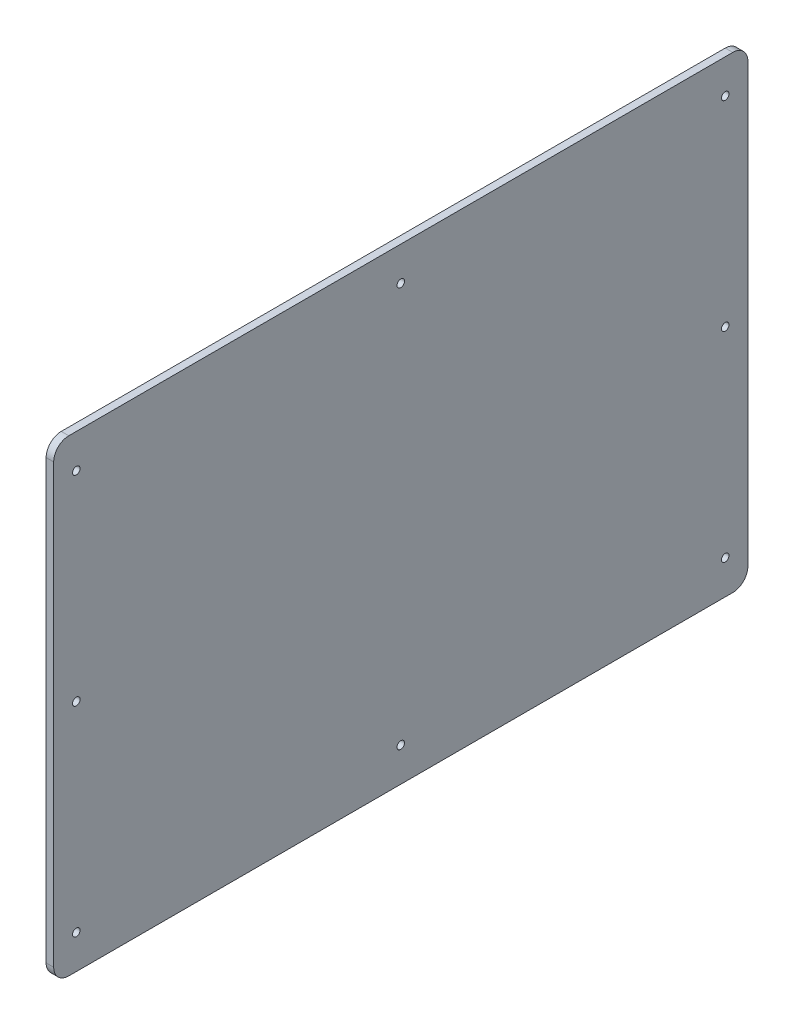
ISO-10303-21;
HEADER;
FILE_DESCRIPTION(('STEP AP214'),'2;1');
FILE_NAME('part.step','',(''),(''),'','','');
FILE_SCHEMA(('AUTOMOTIVE_DESIGN { 1 0 10303 214 1 1 1 1 }'));
ENDSEC;
DATA;
#1=APPLICATION_CONTEXT('core data for automotive mechanical design processes');
#2=APPLICATION_PROTOCOL_DEFINITION('international standard','automotive_design',2000,#1);
#3=PRODUCT_CONTEXT('',#1,'mechanical');
#4=PRODUCT('Part','Part','',(#3));
#5=PRODUCT_RELATED_PRODUCT_CATEGORY('part','',(#4));
#6=PRODUCT_DEFINITION_FORMATION('','',#4);
#7=PRODUCT_DEFINITION_CONTEXT('part definition',#1,'design');
#8=PRODUCT_DEFINITION('design','',#6,#7);
#9=PRODUCT_DEFINITION_SHAPE('','',#8);
#10=(LENGTH_UNIT() NAMED_UNIT(*) SI_UNIT(.MILLI.,.METRE.));
#11=(NAMED_UNIT(*) PLANE_ANGLE_UNIT() SI_UNIT($,.RADIAN.));
#12=(NAMED_UNIT(*) SI_UNIT($,.STERADIAN.) SOLID_ANGLE_UNIT());
#13=UNCERTAINTY_MEASURE_WITH_UNIT(LENGTH_MEASURE(1.E-05),#10,'distance_accuracy_value','');
#14=(GEOMETRIC_REPRESENTATION_CONTEXT(3) GLOBAL_UNCERTAINTY_ASSIGNED_CONTEXT((#13)) GLOBAL_UNIT_ASSIGNED_CONTEXT((#10,
#11,#12)) REPRESENTATION_CONTEXT('',''));
#15=CARTESIAN_POINT('',(0.,0.,0.));
#16=DIRECTION('',(0.,0.,1.));
#17=DIRECTION('',(1.,0.,0.));
#18=AXIS2_PLACEMENT_3D('',#15,#16,#17);
#19=CARTESIAN_POINT('',(493.5,145.,130.));
#20=DIRECTION('',(1.,0.,0.));
#21=DIRECTION('',(0.,0.,1.));
#22=AXIS2_PLACEMENT_3D('',#19,#20,#21);
#23=CYLINDRICAL_SURFACE('',#22,10.);
#24=CARTESIAN_POINT('',(498.5,145.,130.));
#25=DIRECTION('',(-1.,0.,0.));
#26=DIRECTION('',(0.,0.,1.));
#27=AXIS2_PLACEMENT_3D('',#24,#25,#26);
#28=CIRCLE('',#27,10.);
#29=CARTESIAN_POINT('',(498.5,155.,130.));
#30=VERTEX_POINT('',#29);
#31=CARTESIAN_POINT('',(498.5,145.,120.));
#32=VERTEX_POINT('',#31);
#33=EDGE_CURVE('E153',#30,#32,#28,.T.);
#34=ORIENTED_EDGE('',*,*,#33,.T.);
#35=DIRECTION('',(1.,0.,0.));
#36=VECTOR('',#35,1.);
#37=CARTESIAN_POINT('',(493.5,145.,120.));
#38=LINE('',#37,#36);
#39=CARTESIAN_POINT('',(493.5,145.,120.));
#40=VERTEX_POINT('',#39);
#41=EDGE_CURVE('E45',#40,#32,#38,.T.);
#42=ORIENTED_EDGE('',*,*,#41,.F.);
#43=CARTESIAN_POINT('',(493.5,145.,130.));
#44=DIRECTION('',(-1.,0.,0.));
#45=DIRECTION('',(0.,0.,1.));
#46=AXIS2_PLACEMENT_3D('',#43,#44,#45);
#47=CIRCLE('',#46,10.);
#48=CARTESIAN_POINT('',(493.5,155.,130.));
#49=VERTEX_POINT('',#48);
#50=EDGE_CURVE('E167',#49,#40,#47,.T.);
#51=ORIENTED_EDGE('',*,*,#50,.F.);
#52=DIRECTION('',(1.,0.,0.));
#53=VECTOR('',#52,1.);
#54=CARTESIAN_POINT('',(493.5,155.,130.));
#55=LINE('',#54,#53);
#56=EDGE_CURVE('E11',#49,#30,#55,.T.);
#57=ORIENTED_EDGE('',*,*,#56,.T.);
#58=EDGE_LOOP('',(#34,#42,#51,#57));
#59=FACE_BOUND('',#58,.T.);
#60=ADVANCED_FACE('F42',(#59),#23,.T.);
#61=CARTESIAN_POINT('',(493.5,155.,570.));
#62=DIRECTION('',(0.,1.,0.));
#63=DIRECTION('',(0.,0.,1.));
#64=AXIS2_PLACEMENT_3D('',#61,#62,#63);
#65=PLANE('',#64);
#66=DIRECTION('',(0.,0.,-1.));
#67=VECTOR('',#66,1.);
#68=CARTESIAN_POINT('',(498.5,155.,570.));
#69=LINE('',#68,#67);
#70=CARTESIAN_POINT('',(498.5,155.,570.));
#71=VERTEX_POINT('',#70);
#72=EDGE_CURVE('E103',#71,#30,#69,.T.);
#73=ORIENTED_EDGE('',*,*,#72,.T.);
#74=ORIENTED_EDGE('',*,*,#56,.F.);
#75=DIRECTION('',(0.,0.,-1.));
#76=VECTOR('',#75,1.);
#77=CARTESIAN_POINT('',(493.5,155.,570.));
#78=LINE('',#77,#76);
#79=CARTESIAN_POINT('',(493.5,155.,570.));
#80=VERTEX_POINT('',#79);
#81=EDGE_CURVE('E64',#80,#49,#78,.T.);
#82=ORIENTED_EDGE('',*,*,#81,.F.);
#83=DIRECTION('',(1.,0.,0.));
#84=VECTOR('',#83,1.);
#85=CARTESIAN_POINT('',(493.5,155.,570.));
#86=LINE('',#85,#84);
#87=EDGE_CURVE('E51',#80,#71,#86,.T.);
#88=ORIENTED_EDGE('',*,*,#87,.T.);
#89=EDGE_LOOP('',(#73,#74,#82,#88));
#90=FACE_BOUND('',#89,.T.);
#91=ADVANCED_FACE('F286',(#90),#65,.T.);
#92=CARTESIAN_POINT('',(493.5,145.,570.));
#93=DIRECTION('',(1.,0.,0.));
#94=DIRECTION('',(0.,0.,1.));
#95=AXIS2_PLACEMENT_3D('',#92,#93,#94);
#96=CYLINDRICAL_SURFACE('',#95,10.);
#97=CARTESIAN_POINT('',(498.5,145.,570.));
#98=DIRECTION('',(-1.,0.,0.));
#99=DIRECTION('',(0.,0.,1.));
#100=AXIS2_PLACEMENT_3D('',#97,#98,#99);
#101=CIRCLE('',#100,10.);
#102=CARTESIAN_POINT('',(498.5,145.,580.));
#103=VERTEX_POINT('',#102);
#104=EDGE_CURVE('E96',#103,#71,#101,.T.);
#105=ORIENTED_EDGE('',*,*,#104,.T.);
#106=ORIENTED_EDGE('',*,*,#87,.F.);
#107=CARTESIAN_POINT('',(493.5,145.,570.));
#108=DIRECTION('',(-1.,0.,0.));
#109=DIRECTION('',(0.,0.,1.));
#110=AXIS2_PLACEMENT_3D('',#107,#108,#109);
#111=CIRCLE('',#110,10.);
#112=CARTESIAN_POINT('',(493.5,145.,580.));
#113=VERTEX_POINT('',#112);
#114=EDGE_CURVE('E135',#113,#80,#111,.T.);
#115=ORIENTED_EDGE('',*,*,#114,.F.);
#116=DIRECTION('',(1.,0.,0.));
#117=VECTOR('',#116,1.);
#118=CARTESIAN_POINT('',(493.5,145.,580.));
#119=LINE('',#118,#117);
#120=EDGE_CURVE('E142',#113,#103,#119,.T.);
#121=ORIENTED_EDGE('',*,*,#120,.T.);
#122=EDGE_LOOP('',(#105,#106,#115,#121));
#123=FACE_BOUND('',#122,.T.);
#124=ADVANCED_FACE('F148',(#123),#96,.T.);
#125=CARTESIAN_POINT('',(493.5,-145.,580.));
#126=DIRECTION('',(0.,0.,1.));
#127=DIRECTION('',(-1.,0.,0.));
#128=AXIS2_PLACEMENT_3D('',#125,#126,#127);
#129=PLANE('',#128);
#130=DIRECTION('',(0.,1.,0.));
#131=VECTOR('',#130,1.);
#132=CARTESIAN_POINT('',(498.5,-145.,580.));
#133=LINE('',#132,#131);
#134=CARTESIAN_POINT('',(498.5,-145.,580.));
#135=VERTEX_POINT('',#134);
#136=EDGE_CURVE('E145',#135,#103,#133,.T.);
#137=ORIENTED_EDGE('',*,*,#136,.T.);
#138=ORIENTED_EDGE('',*,*,#120,.F.);
#139=DIRECTION('',(0.,1.,0.));
#140=VECTOR('',#139,1.);
#141=CARTESIAN_POINT('',(493.5,-145.,580.));
#142=LINE('',#141,#140);
#143=CARTESIAN_POINT('',(493.5,-145.,580.));
#144=VERTEX_POINT('',#143);
#145=EDGE_CURVE('E131',#144,#113,#142,.T.);
#146=ORIENTED_EDGE('',*,*,#145,.F.);
#147=DIRECTION('',(1.,0.,0.));
#148=VECTOR('',#147,1.);
#149=CARTESIAN_POINT('',(493.5,-145.,580.));
#150=LINE('',#149,#148);
#151=EDGE_CURVE('E146',#144,#135,#150,.T.);
#152=ORIENTED_EDGE('',*,*,#151,.T.);
#153=EDGE_LOOP('',(#137,#138,#146,#152));
#154=FACE_BOUND('',#153,.T.);
#155=ADVANCED_FACE('F143',(#154),#129,.T.);
#156=CARTESIAN_POINT('',(493.5,-145.,570.));
#157=DIRECTION('',(1.,0.,0.));
#158=DIRECTION('',(0.,0.,1.));
#159=AXIS2_PLACEMENT_3D('',#156,#157,#158);
#160=CYLINDRICAL_SURFACE('',#159,10.);
#161=CARTESIAN_POINT('',(498.5,-145.,570.));
#162=DIRECTION('',(-1.,0.,0.));
#163=DIRECTION('',(0.,0.,1.));
#164=AXIS2_PLACEMENT_3D('',#161,#162,#163);
#165=CIRCLE('',#164,10.);
#166=CARTESIAN_POINT('',(498.5,-155.,570.));
#167=VERTEX_POINT('',#166);
#168=EDGE_CURVE('E163',#167,#135,#165,.T.);
#169=ORIENTED_EDGE('',*,*,#168,.T.);
#170=ORIENTED_EDGE('',*,*,#151,.F.);
#171=CARTESIAN_POINT('',(493.5,-145.,570.));
#172=DIRECTION('',(-1.,0.,0.));
#173=DIRECTION('',(0.,0.,1.));
#174=AXIS2_PLACEMENT_3D('',#171,#172,#173);
#175=CIRCLE('',#174,10.);
#176=CARTESIAN_POINT('',(493.5,-155.,570.));
#177=VERTEX_POINT('',#176);
#178=EDGE_CURVE('E137',#177,#144,#175,.T.);
#179=ORIENTED_EDGE('',*,*,#178,.F.);
#180=DIRECTION('',(1.,0.,0.));
#181=VECTOR('',#180,1.);
#182=CARTESIAN_POINT('',(493.5,-155.,570.));
#183=LINE('',#182,#181);
#184=EDGE_CURVE('E171',#177,#167,#183,.T.);
#185=ORIENTED_EDGE('',*,*,#184,.T.);
#186=EDGE_LOOP('',(#169,#170,#179,#185));
#187=FACE_BOUND('',#186,.T.);
#188=ADVANCED_FACE('F297',(#187),#160,.T.);
#189=CARTESIAN_POINT('',(493.5,-155.,130.));
#190=DIRECTION('',(0.,-1.,0.));
#191=DIRECTION('',(0.,0.,-1.));
#192=AXIS2_PLACEMENT_3D('',#189,#190,#191);
#193=PLANE('',#192);
#194=DIRECTION('',(0.,0.,1.));
#195=VECTOR('',#194,1.);
#196=CARTESIAN_POINT('',(498.5,-155.,130.));
#197=LINE('',#196,#195);
#198=CARTESIAN_POINT('',(498.5,-155.,130.));
#199=VERTEX_POINT('',#198);
#200=EDGE_CURVE('E161',#199,#167,#197,.T.);
#201=ORIENTED_EDGE('',*,*,#200,.T.);
#202=ORIENTED_EDGE('',*,*,#184,.F.);
#203=DIRECTION('',(0.,0.,1.));
#204=VECTOR('',#203,1.);
#205=CARTESIAN_POINT('',(493.5,-155.,130.));
#206=LINE('',#205,#204);
#207=CARTESIAN_POINT('',(493.5,-155.,130.));
#208=VERTEX_POINT('',#207);
#209=EDGE_CURVE('E196',#208,#177,#206,.T.);
#210=ORIENTED_EDGE('',*,*,#209,.F.);
#211=DIRECTION('',(1.,0.,0.));
#212=VECTOR('',#211,1.);
#213=CARTESIAN_POINT('',(493.5,-155.,130.));
#214=LINE('',#213,#212);
#215=EDGE_CURVE('E174',#208,#199,#214,.T.);
#216=ORIENTED_EDGE('',*,*,#215,.T.);
#217=EDGE_LOOP('',(#201,#202,#210,#216));
#218=FACE_BOUND('',#217,.T.);
#219=ADVANCED_FACE('F194',(#218),#193,.T.);
#220=CARTESIAN_POINT('',(493.5,-145.,130.));
#221=DIRECTION('',(1.,0.,0.));
#222=DIRECTION('',(0.,0.,1.));
#223=AXIS2_PLACEMENT_3D('',#220,#221,#222);
#224=CYLINDRICAL_SURFACE('',#223,10.);
#225=CARTESIAN_POINT('',(498.5,-145.,130.));
#226=DIRECTION('',(-1.,0.,0.));
#227=DIRECTION('',(0.,0.,1.));
#228=AXIS2_PLACEMENT_3D('',#225,#226,#227);
#229=CIRCLE('',#228,10.);
#230=CARTESIAN_POINT('',(498.5,-145.,120.));
#231=VERTEX_POINT('',#230);
#232=EDGE_CURVE('E159',#231,#199,#229,.T.);
#233=ORIENTED_EDGE('',*,*,#232,.T.);
#234=ORIENTED_EDGE('',*,*,#215,.F.);
#235=CARTESIAN_POINT('',(493.5,-145.,130.));
#236=DIRECTION('',(-1.,0.,0.));
#237=DIRECTION('',(0.,0.,1.));
#238=AXIS2_PLACEMENT_3D('',#235,#236,#237);
#239=CIRCLE('',#238,10.);
#240=CARTESIAN_POINT('',(493.5,-145.,120.));
#241=VERTEX_POINT('',#240);
#242=EDGE_CURVE('E197',#241,#208,#239,.T.);
#243=ORIENTED_EDGE('',*,*,#242,.F.);
#244=DIRECTION('',(1.,0.,0.));
#245=VECTOR('',#244,1.);
#246=CARTESIAN_POINT('',(493.5,-145.,120.));
#247=LINE('',#246,#245);
#248=EDGE_CURVE('E176',#241,#231,#247,.T.);
#249=ORIENTED_EDGE('',*,*,#248,.T.);
#250=EDGE_LOOP('',(#233,#234,#243,#249));
#251=FACE_BOUND('',#250,.T.);
#252=ADVANCED_FACE('F191',(#251),#224,.T.);
#253=CARTESIAN_POINT('',(493.5,145.,120.));
#254=DIRECTION('',(0.,0.,-1.));
#255=DIRECTION('',(0.,1.,0.));
#256=AXIS2_PLACEMENT_3D('',#253,#254,#255);
#257=PLANE('',#256);
#258=DIRECTION('',(0.,-1.,0.));
#259=VECTOR('',#258,1.);
#260=CARTESIAN_POINT('',(498.5,145.,120.));
#261=LINE('',#260,#259);
#262=EDGE_CURVE('E156',#32,#231,#261,.T.);
#263=ORIENTED_EDGE('',*,*,#262,.T.);
#264=ORIENTED_EDGE('',*,*,#248,.F.);
#265=DIRECTION('',(0.,-1.,0.));
#266=VECTOR('',#265,1.);
#267=CARTESIAN_POINT('',(493.5,145.,120.));
#268=LINE('',#267,#266);
#269=EDGE_CURVE('E113',#40,#241,#268,.T.);
#270=ORIENTED_EDGE('',*,*,#269,.F.);
#271=ORIENTED_EDGE('',*,*,#41,.T.);
#272=EDGE_LOOP('',(#263,#264,#270,#271));
#273=FACE_BOUND('',#272,.T.);
#274=ADVANCED_FACE('F182',(#273),#257,.T.);
#275=CARTESIAN_POINT('',(493.5,145.,130.));
#276=DIRECTION('',(1.,0.,0.));
#277=DIRECTION('',(0.,0.,1.));
#278=AXIS2_PLACEMENT_3D('',#275,#276,#277);
#279=PLANE('',#278);
#280=CARTESIAN_POINT('',(493.5,132.5,135.));
#281=DIRECTION('',(-1.,0.,0.));
#282=DIRECTION('',(0.,0.,1.));
#283=AXIS2_PLACEMENT_3D('',#280,#281,#282);
#284=CIRCLE('',#283,2.5);
#285=CARTESIAN_POINT('',(493.5,132.5,137.5));
#286=VERTEX_POINT('',#285);
#287=EDGE_CURVE('E242',#286,#286,#284,.T.);
#288=ORIENTED_EDGE('',*,*,#287,.F.);
#289=EDGE_LOOP('',(#288));
#290=FACE_BOUND('',#289,.T.);
#291=CARTESIAN_POINT('',(493.5,132.5,565.));
#292=DIRECTION('',(-1.,0.,0.));
#293=DIRECTION('',(0.,0.,1.));
#294=AXIS2_PLACEMENT_3D('',#291,#292,#293);
#295=CIRCLE('',#294,2.49999999999991);
#296=CARTESIAN_POINT('',(493.5,132.5,567.5));
#297=VERTEX_POINT('',#296);
#298=EDGE_CURVE('E236',#297,#297,#295,.T.);
#299=ORIENTED_EDGE('',*,*,#298,.F.);
#300=EDGE_LOOP('',(#299));
#301=FACE_BOUND('',#300,.T.);
#302=CARTESIAN_POINT('',(493.5,132.5,350.));
#303=DIRECTION('',(-1.,0.,0.));
#304=DIRECTION('',(0.,0.,1.));
#305=AXIS2_PLACEMENT_3D('',#302,#303,#304);
#306=CIRCLE('',#305,2.50000000000002);
#307=CARTESIAN_POINT('',(493.5,132.5,352.5));
#308=VERTEX_POINT('',#307);
#309=EDGE_CURVE('E230',#308,#308,#306,.T.);
#310=ORIENTED_EDGE('',*,*,#309,.F.);
#311=EDGE_LOOP('',(#310));
#312=FACE_BOUND('',#311,.T.);
#313=CARTESIAN_POINT('',(493.5,0.,135.));
#314=DIRECTION('',(-1.,0.,0.));
#315=DIRECTION('',(0.,0.,1.));
#316=AXIS2_PLACEMENT_3D('',#313,#314,#315);
#317=CIRCLE('',#316,2.5);
#318=CARTESIAN_POINT('',(493.5,0.,137.5));
#319=VERTEX_POINT('',#318);
#320=EDGE_CURVE('E224',#319,#319,#317,.T.);
#321=ORIENTED_EDGE('',*,*,#320,.F.);
#322=EDGE_LOOP('',(#321));
#323=FACE_BOUND('',#322,.T.);
#324=CARTESIAN_POINT('',(493.5,0.,565.));
#325=DIRECTION('',(-1.,0.,0.));
#326=DIRECTION('',(0.,0.,1.));
#327=AXIS2_PLACEMENT_3D('',#324,#325,#326);
#328=CIRCLE('',#327,2.49999999999991);
#329=CARTESIAN_POINT('',(493.5,0.,567.5));
#330=VERTEX_POINT('',#329);
#331=EDGE_CURVE('E218',#330,#330,#328,.T.);
#332=ORIENTED_EDGE('',*,*,#331,.F.);
#333=EDGE_LOOP('',(#332));
#334=FACE_BOUND('',#333,.T.);
#335=CARTESIAN_POINT('',(493.5,-132.5,135.));
#336=DIRECTION('',(-1.,0.,0.));
#337=DIRECTION('',(0.,0.,1.));
#338=AXIS2_PLACEMENT_3D('',#335,#336,#337);
#339=CIRCLE('',#338,2.5);
#340=CARTESIAN_POINT('',(493.5,-132.5,137.5));
#341=VERTEX_POINT('',#340);
#342=EDGE_CURVE('E212',#341,#341,#339,.T.);
#343=ORIENTED_EDGE('',*,*,#342,.F.);
#344=EDGE_LOOP('',(#343));
#345=FACE_BOUND('',#344,.T.);
#346=CARTESIAN_POINT('',(493.5,-132.5,350.));
#347=DIRECTION('',(-1.,0.,0.));
#348=DIRECTION('',(0.,0.,1.));
#349=AXIS2_PLACEMENT_3D('',#346,#347,#348);
#350=CIRCLE('',#349,2.50000000000002);
#351=CARTESIAN_POINT('',(493.5,-132.5,352.5));
#352=VERTEX_POINT('',#351);
#353=EDGE_CURVE('E206',#352,#352,#350,.T.);
#354=ORIENTED_EDGE('',*,*,#353,.F.);
#355=EDGE_LOOP('',(#354));
#356=FACE_BOUND('',#355,.T.);
#357=CARTESIAN_POINT('',(493.5,-132.5,565.));
#358=DIRECTION('',(-1.,0.,0.));
#359=DIRECTION('',(0.,0.,1.));
#360=AXIS2_PLACEMENT_3D('',#357,#358,#359);
#361=CIRCLE('',#360,2.49999999999991);
#362=CARTESIAN_POINT('',(493.5,-132.5,567.5));
#363=VERTEX_POINT('',#362);
#364=EDGE_CURVE('E157',#363,#363,#361,.T.);
#365=ORIENTED_EDGE('',*,*,#364,.F.);
#366=EDGE_LOOP('',(#365));
#367=FACE_BOUND('',#366,.T.);
#368=ORIENTED_EDGE('',*,*,#50,.T.);
#369=ORIENTED_EDGE('',*,*,#269,.T.);
#370=ORIENTED_EDGE('',*,*,#242,.T.);
#371=ORIENTED_EDGE('',*,*,#209,.T.);
#372=ORIENTED_EDGE('',*,*,#178,.T.);
#373=ORIENTED_EDGE('',*,*,#145,.T.);
#374=ORIENTED_EDGE('',*,*,#114,.T.);
#375=ORIENTED_EDGE('',*,*,#81,.T.);
#376=EDGE_LOOP('',(#368,#369,#370,#371,#372,#373,#374,#375));
#377=FACE_BOUND('',#376,.T.);
#378=ADVANCED_FACE('F133',(#290,#301,#312,#323,#334,#345,#356,#367,#377),#279,.F.);
#379=CARTESIAN_POINT('',(498.5,145.,130.));
#380=DIRECTION('',(1.,0.,0.));
#381=DIRECTION('',(0.,0.,1.));
#382=AXIS2_PLACEMENT_3D('',#379,#380,#381);
#383=PLANE('',#382);
#384=CARTESIAN_POINT('',(498.5,132.5,135.));
#385=DIRECTION('',(-1.,0.,0.));
#386=DIRECTION('',(0.,0.,1.));
#387=AXIS2_PLACEMENT_3D('',#384,#385,#386);
#388=CIRCLE('',#387,2.5);
#389=CARTESIAN_POINT('',(498.5,132.5,137.5));
#390=VERTEX_POINT('',#389);
#391=EDGE_CURVE('E245',#390,#390,#388,.T.);
#392=ORIENTED_EDGE('',*,*,#391,.T.);
#393=EDGE_LOOP('',(#392));
#394=FACE_BOUND('',#393,.T.);
#395=CARTESIAN_POINT('',(498.5,132.5,565.));
#396=DIRECTION('',(-1.,0.,0.));
#397=DIRECTION('',(0.,0.,1.));
#398=AXIS2_PLACEMENT_3D('',#395,#396,#397);
#399=CIRCLE('',#398,2.49999999999991);
#400=CARTESIAN_POINT('',(498.5,132.5,567.5));
#401=VERTEX_POINT('',#400);
#402=EDGE_CURVE('E239',#401,#401,#399,.T.);
#403=ORIENTED_EDGE('',*,*,#402,.T.);
#404=EDGE_LOOP('',(#403));
#405=FACE_BOUND('',#404,.T.);
#406=CARTESIAN_POINT('',(498.5,132.5,350.));
#407=DIRECTION('',(-1.,0.,0.));
#408=DIRECTION('',(0.,0.,1.));
#409=AXIS2_PLACEMENT_3D('',#406,#407,#408);
#410=CIRCLE('',#409,2.50000000000002);
#411=CARTESIAN_POINT('',(498.5,132.5,352.5));
#412=VERTEX_POINT('',#411);
#413=EDGE_CURVE('E233',#412,#412,#410,.T.);
#414=ORIENTED_EDGE('',*,*,#413,.T.);
#415=EDGE_LOOP('',(#414));
#416=FACE_BOUND('',#415,.T.);
#417=CARTESIAN_POINT('',(498.5,0.,135.));
#418=DIRECTION('',(-1.,0.,0.));
#419=DIRECTION('',(0.,0.,1.));
#420=AXIS2_PLACEMENT_3D('',#417,#418,#419);
#421=CIRCLE('',#420,2.5);
#422=CARTESIAN_POINT('',(498.5,0.,137.5));
#423=VERTEX_POINT('',#422);
#424=EDGE_CURVE('E227',#423,#423,#421,.T.);
#425=ORIENTED_EDGE('',*,*,#424,.T.);
#426=EDGE_LOOP('',(#425));
#427=FACE_BOUND('',#426,.T.);
#428=CARTESIAN_POINT('',(498.5,0.,565.));
#429=DIRECTION('',(-1.,0.,0.));
#430=DIRECTION('',(0.,0.,1.));
#431=AXIS2_PLACEMENT_3D('',#428,#429,#430);
#432=CIRCLE('',#431,2.49999999999991);
#433=CARTESIAN_POINT('',(498.5,0.,567.5));
#434=VERTEX_POINT('',#433);
#435=EDGE_CURVE('E221',#434,#434,#432,.T.);
#436=ORIENTED_EDGE('',*,*,#435,.T.);
#437=EDGE_LOOP('',(#436));
#438=FACE_BOUND('',#437,.T.);
#439=CARTESIAN_POINT('',(498.5,-132.5,135.));
#440=DIRECTION('',(-1.,0.,0.));
#441=DIRECTION('',(0.,0.,1.));
#442=AXIS2_PLACEMENT_3D('',#439,#440,#441);
#443=CIRCLE('',#442,2.5);
#444=CARTESIAN_POINT('',(498.5,-132.5,137.5));
#445=VERTEX_POINT('',#444);
#446=EDGE_CURVE('E215',#445,#445,#443,.T.);
#447=ORIENTED_EDGE('',*,*,#446,.T.);
#448=EDGE_LOOP('',(#447));
#449=FACE_BOUND('',#448,.T.);
#450=CARTESIAN_POINT('',(498.5,-132.5,350.));
#451=DIRECTION('',(-1.,0.,0.));
#452=DIRECTION('',(0.,0.,1.));
#453=AXIS2_PLACEMENT_3D('',#450,#451,#452);
#454=CIRCLE('',#453,2.50000000000002);
#455=CARTESIAN_POINT('',(498.5,-132.5,352.5));
#456=VERTEX_POINT('',#455);
#457=EDGE_CURVE('E209',#456,#456,#454,.T.);
#458=ORIENTED_EDGE('',*,*,#457,.T.);
#459=EDGE_LOOP('',(#458));
#460=FACE_BOUND('',#459,.T.);
#461=CARTESIAN_POINT('',(498.5,-132.5,565.));
#462=DIRECTION('',(-1.,0.,0.));
#463=DIRECTION('',(0.,0.,1.));
#464=AXIS2_PLACEMENT_3D('',#461,#462,#463);
#465=CIRCLE('',#464,2.49999999999991);
#466=CARTESIAN_POINT('',(498.5,-132.5,567.5));
#467=VERTEX_POINT('',#466);
#468=EDGE_CURVE('E203',#467,#467,#465,.T.);
#469=ORIENTED_EDGE('',*,*,#468,.T.);
#470=EDGE_LOOP('',(#469));
#471=FACE_BOUND('',#470,.T.);
#472=ORIENTED_EDGE('',*,*,#33,.F.);
#473=ORIENTED_EDGE('',*,*,#72,.F.);
#474=ORIENTED_EDGE('',*,*,#104,.F.);
#475=ORIENTED_EDGE('',*,*,#136,.F.);
#476=ORIENTED_EDGE('',*,*,#168,.F.);
#477=ORIENTED_EDGE('',*,*,#200,.F.);
#478=ORIENTED_EDGE('',*,*,#232,.F.);
#479=ORIENTED_EDGE('',*,*,#262,.F.);
#480=EDGE_LOOP('',(#472,#473,#474,#475,#476,#477,#478,#479));
#481=FACE_BOUND('',#480,.T.);
#482=ADVANCED_FACE('F187',(#394,#405,#416,#427,#438,#449,#460,#471,#481),#383,.T.);
#483=CARTESIAN_POINT('',(493.5,-132.5,565.));
#484=DIRECTION('',(1.,0.,0.));
#485=DIRECTION('',(0.,0.,1.));
#486=AXIS2_PLACEMENT_3D('',#483,#484,#485);
#487=CYLINDRICAL_SURFACE('',#486,2.49999999999991);
#488=ORIENTED_EDGE('',*,*,#364,.T.);
#489=EDGE_LOOP('',(#488));
#490=FACE_BOUND('',#489,.T.);
#491=ORIENTED_EDGE('',*,*,#468,.F.);
#492=EDGE_LOOP('',(#491));
#493=FACE_BOUND('',#492,.T.);
#494=ADVANCED_FACE('F271',(#490,#493),#487,.F.);
#495=CARTESIAN_POINT('',(493.5,-132.5,350.));
#496=DIRECTION('',(1.,0.,0.));
#497=DIRECTION('',(0.,0.,1.));
#498=AXIS2_PLACEMENT_3D('',#495,#496,#497);
#499=CYLINDRICAL_SURFACE('',#498,2.50000000000002);
#500=ORIENTED_EDGE('',*,*,#353,.T.);
#501=EDGE_LOOP('',(#500));
#502=FACE_BOUND('',#501,.T.);
#503=ORIENTED_EDGE('',*,*,#457,.F.);
#504=EDGE_LOOP('',(#503));
#505=FACE_BOUND('',#504,.T.);
#506=ADVANCED_FACE('F274',(#502,#505),#499,.F.);
#507=CARTESIAN_POINT('',(493.5,-132.5,135.));
#508=DIRECTION('',(1.,0.,0.));
#509=DIRECTION('',(0.,0.,1.));
#510=AXIS2_PLACEMENT_3D('',#507,#508,#509);
#511=CYLINDRICAL_SURFACE('',#510,2.5);
#512=ORIENTED_EDGE('',*,*,#342,.T.);
#513=EDGE_LOOP('',(#512));
#514=FACE_BOUND('',#513,.T.);
#515=ORIENTED_EDGE('',*,*,#446,.F.);
#516=EDGE_LOOP('',(#515));
#517=FACE_BOUND('',#516,.T.);
#518=ADVANCED_FACE('F365',(#514,#517),#511,.F.);
#519=CARTESIAN_POINT('',(493.5,0.,565.));
#520=DIRECTION('',(1.,0.,0.));
#521=DIRECTION('',(0.,0.,1.));
#522=AXIS2_PLACEMENT_3D('',#519,#520,#521);
#523=CYLINDRICAL_SURFACE('',#522,2.49999999999991);
#524=ORIENTED_EDGE('',*,*,#331,.T.);
#525=EDGE_LOOP('',(#524));
#526=FACE_BOUND('',#525,.T.);
#527=ORIENTED_EDGE('',*,*,#435,.F.);
#528=EDGE_LOOP('',(#527));
#529=FACE_BOUND('',#528,.T.);
#530=ADVANCED_FACE('F376',(#526,#529),#523,.F.);
#531=CARTESIAN_POINT('',(493.5,0.,135.));
#532=DIRECTION('',(1.,0.,0.));
#533=DIRECTION('',(0.,0.,1.));
#534=AXIS2_PLACEMENT_3D('',#531,#532,#533);
#535=CYLINDRICAL_SURFACE('',#534,2.5);
#536=ORIENTED_EDGE('',*,*,#320,.T.);
#537=EDGE_LOOP('',(#536));
#538=FACE_BOUND('',#537,.T.);
#539=ORIENTED_EDGE('',*,*,#424,.F.);
#540=EDGE_LOOP('',(#539));
#541=FACE_BOUND('',#540,.T.);
#542=ADVANCED_FACE('F386',(#538,#541),#535,.F.);
#543=CARTESIAN_POINT('',(493.5,132.5,350.));
#544=DIRECTION('',(1.,0.,0.));
#545=DIRECTION('',(0.,0.,1.));
#546=AXIS2_PLACEMENT_3D('',#543,#544,#545);
#547=CYLINDRICAL_SURFACE('',#546,2.50000000000002);
#548=ORIENTED_EDGE('',*,*,#309,.T.);
#549=EDGE_LOOP('',(#548));
#550=FACE_BOUND('',#549,.T.);
#551=ORIENTED_EDGE('',*,*,#413,.F.);
#552=EDGE_LOOP('',(#551));
#553=FACE_BOUND('',#552,.T.);
#554=ADVANCED_FACE('F396',(#550,#553),#547,.F.);
#555=CARTESIAN_POINT('',(493.5,132.5,565.));
#556=DIRECTION('',(1.,0.,0.));
#557=DIRECTION('',(0.,0.,1.));
#558=AXIS2_PLACEMENT_3D('',#555,#556,#557);
#559=CYLINDRICAL_SURFACE('',#558,2.49999999999991);
#560=ORIENTED_EDGE('',*,*,#298,.T.);
#561=EDGE_LOOP('',(#560));
#562=FACE_BOUND('',#561,.T.);
#563=ORIENTED_EDGE('',*,*,#402,.F.);
#564=EDGE_LOOP('',(#563));
#565=FACE_BOUND('',#564,.T.);
#566=ADVANCED_FACE('F406',(#562,#565),#559,.F.);
#567=CARTESIAN_POINT('',(493.5,132.5,135.));
#568=DIRECTION('',(1.,0.,0.));
#569=DIRECTION('',(0.,0.,1.));
#570=AXIS2_PLACEMENT_3D('',#567,#568,#569);
#571=CYLINDRICAL_SURFACE('',#570,2.5);
#572=ORIENTED_EDGE('',*,*,#287,.T.);
#573=EDGE_LOOP('',(#572));
#574=FACE_BOUND('',#573,.T.);
#575=ORIENTED_EDGE('',*,*,#391,.F.);
#576=EDGE_LOOP('',(#575));
#577=FACE_BOUND('',#576,.T.);
#578=ADVANCED_FACE('F251',(#574,#577),#571,.F.);
#579=CLOSED_SHELL('',(#60,#91,#124,#155,#188,#219,#252,#274,#378,#482,#494,#506,#518,#530,#542,
#554,#566,#578));
#580=MANIFOLD_SOLID_BREP('B2',#579);
#581=ADVANCED_BREP_SHAPE_REPRESENTATION('',(#18,#580),#14);
#582=SHAPE_DEFINITION_REPRESENTATION(#9,#581);
ENDSEC;
END-ISO-10303-21;
